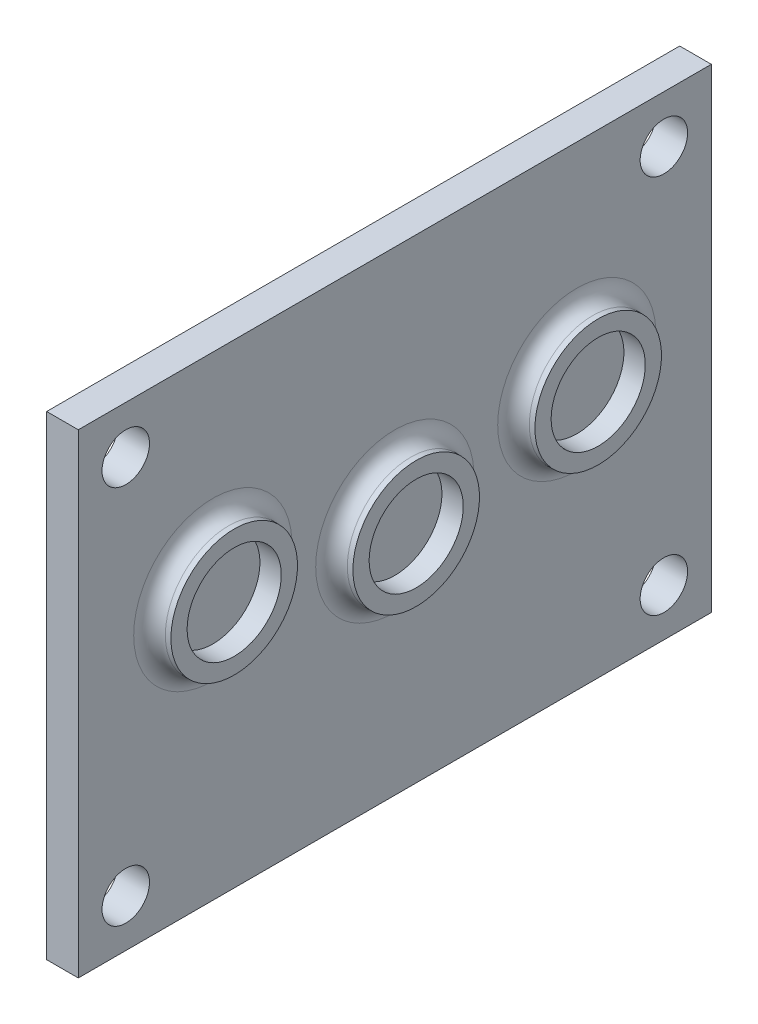
ISO-10303-21;
HEADER;
FILE_DESCRIPTION(('STEP AP214'),'2;1');
FILE_NAME('part.step','',(''),(''),'','','');
FILE_SCHEMA(('AUTOMOTIVE_DESIGN { 1 0 10303 214 1 1 1 1 }'));
ENDSEC;
DATA;
#1=APPLICATION_CONTEXT('core data for automotive mechanical design processes');
#2=APPLICATION_PROTOCOL_DEFINITION('international standard','automotive_design',2000,#1);
#3=PRODUCT_CONTEXT('',#1,'mechanical');
#4=PRODUCT('Part','Part','',(#3));
#5=PRODUCT_RELATED_PRODUCT_CATEGORY('part','',(#4));
#6=PRODUCT_DEFINITION_FORMATION('','',#4);
#7=PRODUCT_DEFINITION_CONTEXT('part definition',#1,'design');
#8=PRODUCT_DEFINITION('design','',#6,#7);
#9=PRODUCT_DEFINITION_SHAPE('','',#8);
#10=(LENGTH_UNIT() NAMED_UNIT(*) SI_UNIT(.MILLI.,.METRE.));
#11=(NAMED_UNIT(*) PLANE_ANGLE_UNIT() SI_UNIT($,.RADIAN.));
#12=(NAMED_UNIT(*) SI_UNIT($,.STERADIAN.) SOLID_ANGLE_UNIT());
#13=UNCERTAINTY_MEASURE_WITH_UNIT(LENGTH_MEASURE(1.E-05),#10,'distance_accuracy_value','');
#14=(GEOMETRIC_REPRESENTATION_CONTEXT(3) GLOBAL_UNCERTAINTY_ASSIGNED_CONTEXT((#13)) GLOBAL_UNIT_ASSIGNED_CONTEXT((#10,
#11,#12)) REPRESENTATION_CONTEXT('',''));
#15=CARTESIAN_POINT('',(0.,0.,0.));
#16=DIRECTION('',(0.,0.,1.));
#17=DIRECTION('',(1.,0.,0.));
#18=AXIS2_PLACEMENT_3D('',#15,#16,#17);
#19=CARTESIAN_POINT('',(2.,0.,0.));
#20=DIRECTION('',(0.,0.,-1.));
#21=DIRECTION('',(-1.,0.,0.));
#22=AXIS2_PLACEMENT_3D('',#19,#20,#21);
#23=PLANE('',#22);
#24=DIRECTION('',(0.,-1.,0.));
#25=VECTOR('',#24,1.);
#26=CARTESIAN_POINT('',(0.,0.,0.));
#27=LINE('',#26,#25);
#28=CARTESIAN_POINT('',(0.,30.,0.));
#29=VERTEX_POINT('',#28);
#30=CARTESIAN_POINT('',(0.,0.,0.));
#31=VERTEX_POINT('',#30);
#32=EDGE_CURVE('E107',#29,#31,#27,.T.);
#33=ORIENTED_EDGE('',*,*,#32,.T.);
#34=DIRECTION('',(-1.,0.,0.));
#35=VECTOR('',#34,1.);
#36=CARTESIAN_POINT('',(2.,0.,0.));
#37=LINE('',#36,#35);
#38=CARTESIAN_POINT('',(2.,0.,0.));
#39=VERTEX_POINT('',#38);
#40=EDGE_CURVE('E98',#39,#31,#37,.T.);
#41=ORIENTED_EDGE('',*,*,#40,.F.);
#42=DIRECTION('',(0.,-1.,0.));
#43=VECTOR('',#42,1.);
#44=CARTESIAN_POINT('',(2.,0.,0.));
#45=LINE('',#44,#43);
#46=CARTESIAN_POINT('',(2.,30.,0.));
#47=VERTEX_POINT('',#46);
#48=EDGE_CURVE('E92',#47,#39,#45,.T.);
#49=ORIENTED_EDGE('',*,*,#48,.F.);
#50=DIRECTION('',(-1.,0.,0.));
#51=VECTOR('',#50,1.);
#52=CARTESIAN_POINT('',(2.,30.,0.));
#53=LINE('',#52,#51);
#54=EDGE_CURVE('E103',#47,#29,#53,.T.);
#55=ORIENTED_EDGE('',*,*,#54,.T.);
#56=EDGE_LOOP('',(#33,#41,#49,#55));
#57=FACE_BOUND('',#56,.T.);
#58=ADVANCED_FACE('F39',(#57),#23,.F.);
#59=CARTESIAN_POINT('',(2.,0.,0.));
#60=DIRECTION('',(0.,1.,0.));
#61=DIRECTION('',(0.,0.,1.));
#62=AXIS2_PLACEMENT_3D('',#59,#60,#61);
#63=PLANE('',#62);
#64=DIRECTION('',(0.,0.,-1.));
#65=VECTOR('',#64,1.);
#66=CARTESIAN_POINT('',(0.,0.,0.));
#67=LINE('',#66,#65);
#68=CARTESIAN_POINT('',(0.,0.,-40.));
#69=VERTEX_POINT('',#68);
#70=EDGE_CURVE('E97',#31,#69,#67,.T.);
#71=ORIENTED_EDGE('',*,*,#70,.T.);
#72=DIRECTION('',(-1.,0.,0.));
#73=VECTOR('',#72,1.);
#74=CARTESIAN_POINT('',(2.,0.,-40.));
#75=LINE('',#74,#73);
#76=CARTESIAN_POINT('',(2.,0.,-40.));
#77=VERTEX_POINT('',#76);
#78=EDGE_CURVE('E95',#77,#69,#75,.T.);
#79=ORIENTED_EDGE('',*,*,#78,.F.);
#80=DIRECTION('',(0.,0.,-1.));
#81=VECTOR('',#80,1.);
#82=CARTESIAN_POINT('',(2.,0.,0.));
#83=LINE('',#82,#81);
#84=EDGE_CURVE('E87',#39,#77,#83,.T.);
#85=ORIENTED_EDGE('',*,*,#84,.F.);
#86=ORIENTED_EDGE('',*,*,#40,.T.);
#87=EDGE_LOOP('',(#71,#79,#85,#86));
#88=FACE_BOUND('',#87,.T.);
#89=ADVANCED_FACE('F96',(#88),#63,.F.);
#90=CARTESIAN_POINT('',(2.,0.,-40.));
#91=DIRECTION('',(0.,0.,1.));
#92=DIRECTION('',(1.,0.,0.));
#93=AXIS2_PLACEMENT_3D('',#90,#91,#92);
#94=PLANE('',#93);
#95=DIRECTION('',(0.,1.,0.));
#96=VECTOR('',#95,1.);
#97=CARTESIAN_POINT('',(0.,0.,-40.));
#98=LINE('',#97,#96);
#99=CARTESIAN_POINT('',(0.,30.,-40.));
#100=VERTEX_POINT('',#99);
#101=EDGE_CURVE('E73',#69,#100,#98,.T.);
#102=ORIENTED_EDGE('',*,*,#101,.T.);
#103=DIRECTION('',(-1.,0.,0.));
#104=VECTOR('',#103,1.);
#105=CARTESIAN_POINT('',(2.,30.,-40.));
#106=LINE('',#105,#104);
#107=CARTESIAN_POINT('',(2.,30.,-40.));
#108=VERTEX_POINT('',#107);
#109=EDGE_CURVE('E99',#108,#100,#106,.T.);
#110=ORIENTED_EDGE('',*,*,#109,.F.);
#111=DIRECTION('',(0.,1.,0.));
#112=VECTOR('',#111,1.);
#113=CARTESIAN_POINT('',(2.,0.,-40.));
#114=LINE('',#113,#112);
#115=EDGE_CURVE('E90',#77,#108,#114,.T.);
#116=ORIENTED_EDGE('',*,*,#115,.F.);
#117=ORIENTED_EDGE('',*,*,#78,.T.);
#118=EDGE_LOOP('',(#102,#110,#116,#117));
#119=FACE_BOUND('',#118,.T.);
#120=ADVANCED_FACE('F101',(#119),#94,.F.);
#121=CARTESIAN_POINT('',(2.,30.,0.));
#122=DIRECTION('',(0.,-1.,0.));
#123=DIRECTION('',(0.,0.,-1.));
#124=AXIS2_PLACEMENT_3D('',#121,#122,#123);
#125=PLANE('',#124);
#126=DIRECTION('',(0.,0.,1.));
#127=VECTOR('',#126,1.);
#128=CARTESIAN_POINT('',(0.,30.,0.));
#129=LINE('',#128,#127);
#130=EDGE_CURVE('E79',#100,#29,#129,.T.);
#131=ORIENTED_EDGE('',*,*,#130,.T.);
#132=ORIENTED_EDGE('',*,*,#54,.F.);
#133=DIRECTION('',(0.,0.,1.));
#134=VECTOR('',#133,1.);
#135=CARTESIAN_POINT('',(2.,30.,0.));
#136=LINE('',#135,#134);
#137=EDGE_CURVE('E56',#108,#47,#136,.T.);
#138=ORIENTED_EDGE('',*,*,#137,.F.);
#139=ORIENTED_EDGE('',*,*,#109,.T.);
#140=EDGE_LOOP('',(#131,#132,#138,#139));
#141=FACE_BOUND('',#140,.T.);
#142=ADVANCED_FACE('F158',(#141),#125,.F.);
#143=CARTESIAN_POINT('',(2.,0.,0.));
#144=DIRECTION('',(-1.,0.,0.));
#145=DIRECTION('',(0.,0.,1.));
#146=AXIS2_PLACEMENT_3D('',#143,#144,#145);
#147=PLANE('',#146);
#148=CARTESIAN_POINT('',(2.,27.,-3.));
#149=DIRECTION('',(-1.,0.,0.));
#150=DIRECTION('',(0.,0.,1.));
#151=AXIS2_PLACEMENT_3D('',#148,#149,#150);
#152=CIRCLE('',#151,1.5);
#153=CARTESIAN_POINT('',(2.,27.,-1.5));
#154=VERTEX_POINT('',#153);
#155=EDGE_CURVE('E239',#154,#154,#152,.T.);
#156=ORIENTED_EDGE('',*,*,#155,.T.);
#157=EDGE_LOOP('',(#156));
#158=FACE_BOUND('',#157,.T.);
#159=CARTESIAN_POINT('',(2.,3.,-37.));
#160=DIRECTION('',(-1.,0.,0.));
#161=DIRECTION('',(0.,0.,1.));
#162=AXIS2_PLACEMENT_3D('',#159,#160,#161);
#163=CIRCLE('',#162,1.5);
#164=CARTESIAN_POINT('',(2.,3.,-35.5));
#165=VERTEX_POINT('',#164);
#166=EDGE_CURVE('E228',#165,#165,#163,.T.);
#167=ORIENTED_EDGE('',*,*,#166,.T.);
#168=EDGE_LOOP('',(#167));
#169=FACE_BOUND('',#168,.T.);
#170=CARTESIAN_POINT('',(2.,3.,-3.));
#171=DIRECTION('',(-1.,0.,0.));
#172=DIRECTION('',(0.,0.,1.));
#173=AXIS2_PLACEMENT_3D('',#170,#171,#172);
#174=CIRCLE('',#173,1.5);
#175=CARTESIAN_POINT('',(2.,3.,-1.5));
#176=VERTEX_POINT('',#175);
#177=EDGE_CURVE('E223',#176,#176,#174,.T.);
#178=ORIENTED_EDGE('',*,*,#177,.T.);
#179=EDGE_LOOP('',(#178));
#180=FACE_BOUND('',#179,.T.);
#181=CARTESIAN_POINT('',(2.,27.,-37.));
#182=DIRECTION('',(-1.,0.,0.));
#183=DIRECTION('',(0.,0.,1.));
#184=AXIS2_PLACEMENT_3D('',#181,#182,#183);
#185=CIRCLE('',#184,1.5);
#186=CARTESIAN_POINT('',(2.,27.,-35.5));
#187=VERTEX_POINT('',#186);
#188=EDGE_CURVE('E244',#187,#187,#185,.T.);
#189=ORIENTED_EDGE('',*,*,#188,.T.);
#190=EDGE_LOOP('',(#189));
#191=FACE_BOUND('',#190,.T.);
#192=CARTESIAN_POINT('',(2.,17.,-8.5));
#193=DIRECTION('',(-1.,0.,0.));
#194=DIRECTION('',(0.,0.,1.));
#195=AXIS2_PLACEMENT_3D('',#192,#193,#194);
#196=CIRCLE('',#195,5.);
#197=CARTESIAN_POINT('',(2.,17.,-3.5));
#198=VERTEX_POINT('',#197);
#199=EDGE_CURVE('E126',#198,#198,#196,.T.);
#200=ORIENTED_EDGE('',*,*,#199,.T.);
#201=EDGE_LOOP('',(#200));
#202=FACE_BOUND('',#201,.T.);
#203=CARTESIAN_POINT('',(2.,17.,-31.5));
#204=DIRECTION('',(-1.,0.,0.));
#205=DIRECTION('',(0.,0.,1.));
#206=AXIS2_PLACEMENT_3D('',#203,#204,#205);
#207=CIRCLE('',#206,5.00000000000001);
#208=CARTESIAN_POINT('',(2.,17.,-26.5));
#209=VERTEX_POINT('',#208);
#210=EDGE_CURVE('E123',#209,#209,#207,.T.);
#211=ORIENTED_EDGE('',*,*,#210,.T.);
#212=EDGE_LOOP('',(#211));
#213=FACE_BOUND('',#212,.T.);
#214=CARTESIAN_POINT('',(2.,15.,-20.));
#215=DIRECTION('',(-1.,0.,0.));
#216=DIRECTION('',(0.,0.,1.));
#217=AXIS2_PLACEMENT_3D('',#214,#215,#216);
#218=CIRCLE('',#217,5.);
#219=CARTESIAN_POINT('',(2.,15.,-15.));
#220=VERTEX_POINT('',#219);
#221=EDGE_CURVE('E120',#220,#220,#218,.T.);
#222=ORIENTED_EDGE('',*,*,#221,.T.);
#223=EDGE_LOOP('',(#222));
#224=FACE_BOUND('',#223,.T.);
#225=ORIENTED_EDGE('',*,*,#48,.T.);
#226=ORIENTED_EDGE('',*,*,#84,.T.);
#227=ORIENTED_EDGE('',*,*,#115,.T.);
#228=ORIENTED_EDGE('',*,*,#137,.T.);
#229=EDGE_LOOP('',(#225,#226,#227,#228));
#230=FACE_BOUND('',#229,.T.);
#231=ADVANCED_FACE('F88',(#158,#169,#180,#191,#202,#213,#224,#230),#147,.F.);
#232=CARTESIAN_POINT('',(0.,0.,0.));
#233=DIRECTION('',(-1.,0.,0.));
#234=DIRECTION('',(0.,0.,1.));
#235=AXIS2_PLACEMENT_3D('',#232,#233,#234);
#236=PLANE('',#235);
#237=CARTESIAN_POINT('',(0.,27.,-3.));
#238=DIRECTION('',(-1.,0.,0.));
#239=DIRECTION('',(0.,0.,1.));
#240=AXIS2_PLACEMENT_3D('',#237,#238,#239);
#241=CIRCLE('',#240,1.5);
#242=CARTESIAN_POINT('',(0.,27.,-1.5));
#243=VERTEX_POINT('',#242);
#244=EDGE_CURVE('E235',#243,#243,#241,.T.);
#245=ORIENTED_EDGE('',*,*,#244,.F.);
#246=EDGE_LOOP('',(#245));
#247=FACE_BOUND('',#246,.T.);
#248=CARTESIAN_POINT('',(0.,3.,-37.));
#249=DIRECTION('',(-1.,0.,0.));
#250=DIRECTION('',(0.,0.,1.));
#251=AXIS2_PLACEMENT_3D('',#248,#249,#250);
#252=CIRCLE('',#251,1.5);
#253=CARTESIAN_POINT('',(0.,3.,-35.5));
#254=VERTEX_POINT('',#253);
#255=EDGE_CURVE('E231',#254,#254,#252,.T.);
#256=ORIENTED_EDGE('',*,*,#255,.F.);
#257=EDGE_LOOP('',(#256));
#258=FACE_BOUND('',#257,.T.);
#259=CARTESIAN_POINT('',(0.,3.,-3.));
#260=DIRECTION('',(-1.,0.,0.));
#261=DIRECTION('',(0.,0.,1.));
#262=AXIS2_PLACEMENT_3D('',#259,#260,#261);
#263=CIRCLE('',#262,1.5);
#264=CARTESIAN_POINT('',(0.,3.,-1.5));
#265=VERTEX_POINT('',#264);
#266=EDGE_CURVE('E226',#265,#265,#263,.T.);
#267=ORIENTED_EDGE('',*,*,#266,.F.);
#268=EDGE_LOOP('',(#267));
#269=FACE_BOUND('',#268,.T.);
#270=CARTESIAN_POINT('',(0.,27.,-37.));
#271=DIRECTION('',(-1.,0.,0.));
#272=DIRECTION('',(0.,0.,1.));
#273=AXIS2_PLACEMENT_3D('',#270,#271,#272);
#274=CIRCLE('',#273,1.5);
#275=CARTESIAN_POINT('',(0.,27.,-35.5));
#276=VERTEX_POINT('',#275);
#277=EDGE_CURVE('E238',#276,#276,#274,.T.);
#278=ORIENTED_EDGE('',*,*,#277,.F.);
#279=EDGE_LOOP('',(#278));
#280=FACE_BOUND('',#279,.T.);
#281=ORIENTED_EDGE('',*,*,#32,.F.);
#282=ORIENTED_EDGE('',*,*,#130,.F.);
#283=ORIENTED_EDGE('',*,*,#101,.F.);
#284=ORIENTED_EDGE('',*,*,#70,.F.);
#285=EDGE_LOOP('',(#281,#282,#283,#284));
#286=FACE_BOUND('',#285,.T.);
#287=ADVANCED_FACE('F161',(#247,#258,#269,#280,#286),#236,.T.);
#288=CARTESIAN_POINT('',(3.35,17.,-8.5));
#289=DIRECTION('',(1.,0.,0.));
#290=DIRECTION('',(0.,0.,-1.));
#291=AXIS2_PLACEMENT_3D('',#288,#289,#290);
#292=PLANE('',#291);
#293=CARTESIAN_POINT('',(3.35,17.,-8.5));
#294=DIRECTION('',(1.,0.,0.));
#295=DIRECTION('',(0.,0.,-1.));
#296=AXIS2_PLACEMENT_3D('',#293,#294,#295);
#297=CIRCLE('',#296,4.);
#298=CARTESIAN_POINT('',(3.35,17.,-4.5));
#299=VERTEX_POINT('',#298);
#300=EDGE_CURVE('E110',#299,#299,#297,.T.);
#301=ORIENTED_EDGE('',*,*,#300,.T.);
#302=EDGE_LOOP('',(#301));
#303=FACE_BOUND('',#302,.T.);
#304=CARTESIAN_POINT('',(3.35,17.,-8.5));
#305=DIRECTION('',(1.,0.,0.));
#306=DIRECTION('',(0.,0.,-1.));
#307=AXIS2_PLACEMENT_3D('',#304,#305,#306);
#308=CIRCLE('',#307,2.975);
#309=CARTESIAN_POINT('',(3.35,17.,-5.525));
#310=VERTEX_POINT('',#309);
#311=EDGE_CURVE('E268',#310,#310,#308,.T.);
#312=ORIENTED_EDGE('',*,*,#311,.F.);
#313=EDGE_LOOP('',(#312));
#314=FACE_BOUND('',#313,.T.);
#315=ADVANCED_FACE('F164',(#303,#314),#292,.T.);
#316=CARTESIAN_POINT('',(3.35,17.,-8.5));
#317=DIRECTION('',(-1.,0.,0.));
#318=DIRECTION('',(0.,0.,1.));
#319=AXIS2_PLACEMENT_3D('',#316,#317,#318);
#320=CYLINDRICAL_SURFACE('',#319,4.);
#321=CARTESIAN_POINT('',(3.,17.,-8.5));
#322=DIRECTION('',(-1.,0.,0.));
#323=DIRECTION('',(0.,0.,1.));
#324=AXIS2_PLACEMENT_3D('',#321,#322,#323);
#325=CIRCLE('',#324,4.);
#326=CARTESIAN_POINT('',(3.,17.,-4.5));
#327=VERTEX_POINT('',#326);
#328=EDGE_CURVE('E117',#327,#327,#325,.F.);
#329=CARTESIAN_POINT('',(3.,17.,-4.5));
#330=CARTESIAN_POINT('',(3.00364583333333,17.,-4.5));
#331=CARTESIAN_POINT('',(3.00729166666667,17.,-4.5));
#332=CARTESIAN_POINT('',(3.01458333333333,17.,-4.5));
#333=CARTESIAN_POINT('',(3.01822916666667,17.,-4.5));
#334=CARTESIAN_POINT('',(3.02552083333333,17.,-4.5));
#335=CARTESIAN_POINT('',(3.02916666666667,17.,-4.5));
#336=CARTESIAN_POINT('',(3.03645833333333,17.,-4.5));
#337=CARTESIAN_POINT('',(3.04010416666667,17.,-4.5));
#338=CARTESIAN_POINT('',(3.04739583333333,17.,-4.5));
#339=CARTESIAN_POINT('',(3.05104166666667,17.,-4.5));
#340=CARTESIAN_POINT('',(3.05833333333333,17.,-4.5));
#341=CARTESIAN_POINT('',(3.06197916666667,17.,-4.5));
#342=CARTESIAN_POINT('',(3.06927083333333,17.,-4.5));
#343=CARTESIAN_POINT('',(3.07291666666667,17.,-4.5));
#344=CARTESIAN_POINT('',(3.08020833333333,17.,-4.5));
#345=CARTESIAN_POINT('',(3.08385416666667,17.,-4.5));
#346=CARTESIAN_POINT('',(3.09114583333333,17.,-4.5));
#347=CARTESIAN_POINT('',(3.09479166666667,17.,-4.5));
#348=CARTESIAN_POINT('',(3.10208333333333,17.,-4.5));
#349=CARTESIAN_POINT('',(3.10572916666667,17.,-4.5));
#350=CARTESIAN_POINT('',(3.11302083333333,17.,-4.5));
#351=CARTESIAN_POINT('',(3.11666666666667,17.,-4.5));
#352=CARTESIAN_POINT('',(3.12395833333333,17.,-4.5));
#353=CARTESIAN_POINT('',(3.12760416666667,17.,-4.5));
#354=CARTESIAN_POINT('',(3.13489583333333,17.,-4.5));
#355=CARTESIAN_POINT('',(3.13854166666667,17.,-4.5));
#356=CARTESIAN_POINT('',(3.14583333333333,17.,-4.5));
#357=CARTESIAN_POINT('',(3.14947916666667,17.,-4.5));
#358=CARTESIAN_POINT('',(3.15677083333333,17.,-4.5));
#359=CARTESIAN_POINT('',(3.16041666666667,17.,-4.5));
#360=CARTESIAN_POINT('',(3.16770833333333,17.,-4.5));
#361=CARTESIAN_POINT('',(3.17135416666667,17.,-4.5));
#362=CARTESIAN_POINT('',(3.17864583333333,17.,-4.5));
#363=CARTESIAN_POINT('',(3.18229166666667,17.,-4.5));
#364=CARTESIAN_POINT('',(3.18958333333333,17.,-4.5));
#365=CARTESIAN_POINT('',(3.19322916666667,17.,-4.5));
#366=CARTESIAN_POINT('',(3.20052083333333,17.,-4.5));
#367=CARTESIAN_POINT('',(3.20416666666667,17.,-4.5));
#368=CARTESIAN_POINT('',(3.21145833333333,17.,-4.5));
#369=CARTESIAN_POINT('',(3.21510416666667,17.,-4.5));
#370=CARTESIAN_POINT('',(3.22239583333333,17.,-4.5));
#371=CARTESIAN_POINT('',(3.22604166666667,17.,-4.5));
#372=CARTESIAN_POINT('',(3.23333333333333,17.,-4.5));
#373=CARTESIAN_POINT('',(3.23697916666667,17.,-4.5));
#374=CARTESIAN_POINT('',(3.24427083333333,17.,-4.5));
#375=CARTESIAN_POINT('',(3.24791666666667,17.,-4.5));
#376=CARTESIAN_POINT('',(3.25520833333333,17.,-4.5));
#377=CARTESIAN_POINT('',(3.25885416666667,17.,-4.5));
#378=CARTESIAN_POINT('',(3.26614583333333,17.,-4.5));
#379=CARTESIAN_POINT('',(3.26979166666667,17.,-4.5));
#380=CARTESIAN_POINT('',(3.27708333333333,17.,-4.5));
#381=CARTESIAN_POINT('',(3.28072916666667,17.,-4.5));
#382=CARTESIAN_POINT('',(3.28802083333333,17.,-4.5));
#383=CARTESIAN_POINT('',(3.29166666666667,17.,-4.5));
#384=CARTESIAN_POINT('',(3.29895833333333,17.,-4.5));
#385=CARTESIAN_POINT('',(3.30260416666667,17.,-4.5));
#386=CARTESIAN_POINT('',(3.30989583333333,17.,-4.5));
#387=CARTESIAN_POINT('',(3.31354166666667,17.,-4.5));
#388=CARTESIAN_POINT('',(3.32083333333333,17.,-4.5));
#389=CARTESIAN_POINT('',(3.32447916666667,17.,-4.5));
#390=CARTESIAN_POINT('',(3.33177083333333,17.,-4.5));
#391=CARTESIAN_POINT('',(3.33541666666667,17.,-4.5));
#392=CARTESIAN_POINT('',(3.34270833333333,17.,-4.5));
#393=CARTESIAN_POINT('',(3.34635416666667,17.,-4.5));
#394=CARTESIAN_POINT('',(3.35,17.,-4.5));
#395=B_SPLINE_CURVE_WITH_KNOTS('',3,(#329,#330,#331,#332,#333,#334,#335,#336,#337,#338,#339,
#340,#341,#342,#343,#344,#345,#346,#347,#348,#349,#350,#351,#352,#353,#354,#355,#356,#357,#358,
#359,#360,#361,#362,#363,#364,#365,#366,#367,#368,#369,#370,#371,#372,#373,#374,#375,#376,#377,
#378,#379,#380,#381,#382,#383,#384,#385,#386,#387,#388,#389,#390,#391,#392,#393,#394),
.UNSPECIFIED.,.F.,.F.,(4,2,2,2,2,2,2,2,2,2,2,2,2,2,2,2,2,2,2,2,2,2,2,2,2,2,2,2,2,2,2,2,4),(0.,
0.0109374999999997,0.0218749999999998,0.0328124999999999,0.04375,0.0546874999999996,
0.0656249999999997,0.0765624999999998,0.0874999999999999,0.0984374999999996,0.109375,0.1203125,
0.13125,0.1421875,0.153125,0.1640625,0.175,0.185937499999999,0.196875,0.2078125,0.21875,
0.229687499999999,0.240625,0.2515625,0.2625,0.273437499999999,0.284374999999999,0.2953125,
0.30625,0.317187499999999,0.328124999999999,0.3390625,0.35),.UNSPECIFIED.);
#396=EDGE_CURVE('BSEAM170',#327,#299,#395,.T.);
#397=ORIENTED_EDGE('',*,*,#328,.T.);
#398=ORIENTED_EDGE('',*,*,#300,.F.);
#399=ORIENTED_EDGE('',*,*,#396,.T.);
#400=ORIENTED_EDGE('',*,*,#396,.F.);
#401=EDGE_LOOP('',(#397,#399,#398,#400));
#402=FACE_BOUND('',#401,.T.);
#403=ADVANCED_FACE('F170',(#402),#320,.T.);
#404=CARTESIAN_POINT('',(3.35,17.,-8.5));
#405=DIRECTION('',(-1.,0.,0.));
#406=DIRECTION('',(0.,0.,1.));
#407=AXIS2_PLACEMENT_3D('',#404,#405,#406);
#408=CYLINDRICAL_SURFACE('',#407,2.975);
#409=CARTESIAN_POINT('',(2.,17.,-8.5));
#410=DIRECTION('',(1.,0.,0.));
#411=DIRECTION('',(0.,0.,-1.));
#412=AXIS2_PLACEMENT_3D('',#409,#410,#411);
#413=CIRCLE('',#412,2.975);
#414=CARTESIAN_POINT('',(2.,17.,-5.525));
#415=VERTEX_POINT('',#414);
#416=EDGE_CURVE('E265',#415,#415,#413,.T.);
#417=CARTESIAN_POINT('',(3.35,17.,-5.525));
#418=CARTESIAN_POINT('',(3.3359375,17.,-5.525));
#419=CARTESIAN_POINT('',(3.321875,17.,-5.525));
#420=CARTESIAN_POINT('',(3.29375,17.,-5.525));
#421=CARTESIAN_POINT('',(3.2796875,17.,-5.525));
#422=CARTESIAN_POINT('',(3.2515625,17.,-5.525));
#423=CARTESIAN_POINT('',(3.2375,17.,-5.525));
#424=CARTESIAN_POINT('',(3.209375,17.,-5.525));
#425=CARTESIAN_POINT('',(3.1953125,17.,-5.525));
#426=CARTESIAN_POINT('',(3.1671875,17.,-5.525));
#427=CARTESIAN_POINT('',(3.153125,17.,-5.525));
#428=CARTESIAN_POINT('',(3.125,17.,-5.525));
#429=CARTESIAN_POINT('',(3.1109375,17.,-5.525));
#430=CARTESIAN_POINT('',(3.0828125,17.,-5.525));
#431=CARTESIAN_POINT('',(3.06875,17.,-5.525));
#432=CARTESIAN_POINT('',(3.040625,17.,-5.525));
#433=CARTESIAN_POINT('',(3.0265625,17.,-5.525));
#434=CARTESIAN_POINT('',(2.9984375,17.,-5.525));
#435=CARTESIAN_POINT('',(2.984375,17.,-5.525));
#436=CARTESIAN_POINT('',(2.95625,17.,-5.525));
#437=CARTESIAN_POINT('',(2.9421875,17.,-5.525));
#438=CARTESIAN_POINT('',(2.9140625,17.,-5.525));
#439=CARTESIAN_POINT('',(2.9,17.,-5.525));
#440=CARTESIAN_POINT('',(2.871875,17.,-5.525));
#441=CARTESIAN_POINT('',(2.8578125,17.,-5.525));
#442=CARTESIAN_POINT('',(2.8296875,17.,-5.525));
#443=CARTESIAN_POINT('',(2.815625,17.,-5.525));
#444=CARTESIAN_POINT('',(2.7875,17.,-5.525));
#445=CARTESIAN_POINT('',(2.7734375,17.,-5.525));
#446=CARTESIAN_POINT('',(2.7453125,17.,-5.525));
#447=CARTESIAN_POINT('',(2.73125,17.,-5.525));
#448=CARTESIAN_POINT('',(2.703125,17.,-5.525));
#449=CARTESIAN_POINT('',(2.6890625,17.,-5.525));
#450=CARTESIAN_POINT('',(2.6609375,17.,-5.525));
#451=CARTESIAN_POINT('',(2.646875,17.,-5.525));
#452=CARTESIAN_POINT('',(2.61875,17.,-5.525));
#453=CARTESIAN_POINT('',(2.6046875,17.,-5.525));
#454=CARTESIAN_POINT('',(2.5765625,17.,-5.525));
#455=CARTESIAN_POINT('',(2.5625,17.,-5.525));
#456=CARTESIAN_POINT('',(2.534375,17.,-5.525));
#457=CARTESIAN_POINT('',(2.5203125,17.,-5.525));
#458=CARTESIAN_POINT('',(2.4921875,17.,-5.525));
#459=CARTESIAN_POINT('',(2.478125,17.,-5.525));
#460=CARTESIAN_POINT('',(2.45,17.,-5.525));
#461=CARTESIAN_POINT('',(2.4359375,17.,-5.525));
#462=CARTESIAN_POINT('',(2.4078125,17.,-5.525));
#463=CARTESIAN_POINT('',(2.39375,17.,-5.525));
#464=CARTESIAN_POINT('',(2.365625,17.,-5.525));
#465=CARTESIAN_POINT('',(2.3515625,17.,-5.525));
#466=CARTESIAN_POINT('',(2.3234375,17.,-5.525));
#467=CARTESIAN_POINT('',(2.309375,17.,-5.525));
#468=CARTESIAN_POINT('',(2.28125,17.,-5.525));
#469=CARTESIAN_POINT('',(2.2671875,17.,-5.525));
#470=CARTESIAN_POINT('',(2.2390625,17.,-5.525));
#471=CARTESIAN_POINT('',(2.225,17.,-5.525));
#472=CARTESIAN_POINT('',(2.196875,17.,-5.525));
#473=CARTESIAN_POINT('',(2.1828125,17.,-5.525));
#474=CARTESIAN_POINT('',(2.1546875,17.,-5.525));
#475=CARTESIAN_POINT('',(2.140625,17.,-5.525));
#476=CARTESIAN_POINT('',(2.1125,17.,-5.525));
#477=CARTESIAN_POINT('',(2.0984375,17.,-5.525));
#478=CARTESIAN_POINT('',(2.0703125,17.,-5.525));
#479=CARTESIAN_POINT('',(2.05625,17.,-5.525));
#480=CARTESIAN_POINT('',(2.028125,17.,-5.525));
#481=CARTESIAN_POINT('',(2.0140625,17.,-5.525));
#482=CARTESIAN_POINT('',(2.,17.,-5.525));
#483=B_SPLINE_CURVE_WITH_KNOTS('',3,(#417,#418,#419,#420,#421,#422,#423,#424,#425,#426,#427,
#428,#429,#430,#431,#432,#433,#434,#435,#436,#437,#438,#439,#440,#441,#442,#443,#444,#445,#446,
#447,#448,#449,#450,#451,#452,#453,#454,#455,#456,#457,#458,#459,#460,#461,#462,#463,#464,#465,
#466,#467,#468,#469,#470,#471,#472,#473,#474,#475,#476,#477,#478,#479,#480,#481,#482),
.UNSPECIFIED.,.F.,.F.,(4,2,2,2,2,2,2,2,2,2,2,2,2,2,2,2,2,2,2,2,2,2,2,2,2,2,2,2,2,2,2,2,4),(0.,
0.0421875000000001,0.0843750000000003,0.1265625,0.16875,0.2109375,0.253125,0.2953125,0.3375,
0.3796875,0.421875,0.4640625,0.50625,0.5484375,0.590625,0.6328125,0.675,0.7171875,0.759375,
0.8015625,0.84375,0.8859375,0.928125000000001,0.9703125,1.0125,1.0546875,1.096875,1.1390625,
1.18125,1.2234375,1.265625,1.3078125,1.35),.UNSPECIFIED.);
#484=EDGE_CURVE('BSEAM173',#310,#415,#483,.T.);
#485=ORIENTED_EDGE('',*,*,#311,.T.);
#486=ORIENTED_EDGE('',*,*,#416,.F.);
#487=ORIENTED_EDGE('',*,*,#484,.T.);
#488=ORIENTED_EDGE('',*,*,#484,.F.);
#489=EDGE_LOOP('',(#485,#487,#486,#488));
#490=FACE_BOUND('',#489,.T.);
#491=ADVANCED_FACE('F173',(#490),#408,.F.);
#492=ORIENTED_EDGE('',*,*,#416,.T.);
#493=EDGE_LOOP('',(#492));
#494=FACE_BOUND('',#493,.T.);
#495=ADVANCED_FACE('F169',(#494),#147,.F.);
#496=CARTESIAN_POINT('',(3.35,15.,-20.));
#497=DIRECTION('',(1.,0.,0.));
#498=DIRECTION('',(0.,0.,-1.));
#499=AXIS2_PLACEMENT_3D('',#496,#497,#498);
#500=PLANE('',#499);
#501=CARTESIAN_POINT('',(3.35,15.,-20.));
#502=DIRECTION('',(1.,0.,0.));
#503=DIRECTION('',(0.,0.,-1.));
#504=AXIS2_PLACEMENT_3D('',#501,#502,#503);
#505=CIRCLE('',#504,4.);
#506=CARTESIAN_POINT('',(3.35,15.,-16.));
#507=VERTEX_POINT('',#506);
#508=EDGE_CURVE('E256',#507,#507,#505,.T.);
#509=ORIENTED_EDGE('',*,*,#508,.T.);
#510=EDGE_LOOP('',(#509));
#511=FACE_BOUND('',#510,.T.);
#512=CARTESIAN_POINT('',(3.35,15.,-20.));
#513=DIRECTION('',(1.,0.,0.));
#514=DIRECTION('',(0.,0.,-1.));
#515=AXIS2_PLACEMENT_3D('',#512,#513,#514);
#516=CIRCLE('',#515,2.975);
#517=CARTESIAN_POINT('',(3.35,15.,-17.025));
#518=VERTEX_POINT('',#517);
#519=EDGE_CURVE('E261',#518,#518,#516,.T.);
#520=ORIENTED_EDGE('',*,*,#519,.F.);
#521=EDGE_LOOP('',(#520));
#522=FACE_BOUND('',#521,.T.);
#523=ADVANCED_FACE('F187',(#511,#522),#500,.T.);
#524=CARTESIAN_POINT('',(3.35,15.,-20.));
#525=DIRECTION('',(-1.,0.,0.));
#526=DIRECTION('',(0.,0.,1.));
#527=AXIS2_PLACEMENT_3D('',#524,#525,#526);
#528=CYLINDRICAL_SURFACE('',#527,4.);
#529=CARTESIAN_POINT('',(3.,15.,-20.));
#530=DIRECTION('',(-1.,0.,0.));
#531=DIRECTION('',(0.,0.,1.));
#532=AXIS2_PLACEMENT_3D('',#529,#530,#531);
#533=CIRCLE('',#532,4.);
#534=CARTESIAN_POINT('',(3.,15.,-16.));
#535=VERTEX_POINT('',#534);
#536=EDGE_CURVE('E11',#535,#535,#533,.F.);
#537=CARTESIAN_POINT('',(3.,15.,-16.));
#538=CARTESIAN_POINT('',(3.00364583333333,15.,-16.));
#539=CARTESIAN_POINT('',(3.00729166666667,15.,-16.));
#540=CARTESIAN_POINT('',(3.01458333333333,15.,-16.));
#541=CARTESIAN_POINT('',(3.01822916666667,15.,-16.));
#542=CARTESIAN_POINT('',(3.02552083333333,15.,-16.));
#543=CARTESIAN_POINT('',(3.02916666666667,15.,-16.));
#544=CARTESIAN_POINT('',(3.03645833333333,15.,-16.));
#545=CARTESIAN_POINT('',(3.04010416666667,15.,-16.));
#546=CARTESIAN_POINT('',(3.04739583333333,15.,-16.));
#547=CARTESIAN_POINT('',(3.05104166666667,15.,-16.));
#548=CARTESIAN_POINT('',(3.05833333333333,15.,-16.));
#549=CARTESIAN_POINT('',(3.06197916666667,15.,-16.));
#550=CARTESIAN_POINT('',(3.06927083333333,15.,-16.));
#551=CARTESIAN_POINT('',(3.07291666666667,15.,-16.));
#552=CARTESIAN_POINT('',(3.08020833333333,15.,-16.));
#553=CARTESIAN_POINT('',(3.08385416666667,15.,-16.));
#554=CARTESIAN_POINT('',(3.09114583333333,15.,-16.));
#555=CARTESIAN_POINT('',(3.09479166666667,15.,-16.));
#556=CARTESIAN_POINT('',(3.10208333333333,15.,-16.));
#557=CARTESIAN_POINT('',(3.10572916666667,15.,-16.));
#558=CARTESIAN_POINT('',(3.11302083333333,15.,-16.));
#559=CARTESIAN_POINT('',(3.11666666666667,15.,-16.));
#560=CARTESIAN_POINT('',(3.12395833333333,15.,-16.));
#561=CARTESIAN_POINT('',(3.12760416666667,15.,-16.));
#562=CARTESIAN_POINT('',(3.13489583333333,15.,-16.));
#563=CARTESIAN_POINT('',(3.13854166666667,15.,-16.));
#564=CARTESIAN_POINT('',(3.14583333333333,15.,-16.));
#565=CARTESIAN_POINT('',(3.14947916666667,15.,-16.));
#566=CARTESIAN_POINT('',(3.15677083333333,15.,-16.));
#567=CARTESIAN_POINT('',(3.16041666666667,15.,-16.));
#568=CARTESIAN_POINT('',(3.16770833333333,15.,-16.));
#569=CARTESIAN_POINT('',(3.17135416666667,15.,-16.));
#570=CARTESIAN_POINT('',(3.17864583333333,15.,-16.));
#571=CARTESIAN_POINT('',(3.18229166666667,15.,-16.));
#572=CARTESIAN_POINT('',(3.18958333333333,15.,-16.));
#573=CARTESIAN_POINT('',(3.19322916666667,15.,-16.));
#574=CARTESIAN_POINT('',(3.20052083333333,15.,-16.));
#575=CARTESIAN_POINT('',(3.20416666666667,15.,-16.));
#576=CARTESIAN_POINT('',(3.21145833333333,15.,-16.));
#577=CARTESIAN_POINT('',(3.21510416666667,15.,-16.));
#578=CARTESIAN_POINT('',(3.22239583333333,15.,-16.));
#579=CARTESIAN_POINT('',(3.22604166666667,15.,-16.));
#580=CARTESIAN_POINT('',(3.23333333333333,15.,-16.));
#581=CARTESIAN_POINT('',(3.23697916666667,15.,-16.));
#582=CARTESIAN_POINT('',(3.24427083333333,15.,-16.));
#583=CARTESIAN_POINT('',(3.24791666666667,15.,-16.));
#584=CARTESIAN_POINT('',(3.25520833333333,15.,-16.));
#585=CARTESIAN_POINT('',(3.25885416666667,15.,-16.));
#586=CARTESIAN_POINT('',(3.26614583333333,15.,-16.));
#587=CARTESIAN_POINT('',(3.26979166666667,15.,-16.));
#588=CARTESIAN_POINT('',(3.27708333333333,15.,-16.));
#589=CARTESIAN_POINT('',(3.28072916666667,15.,-16.));
#590=CARTESIAN_POINT('',(3.28802083333333,15.,-16.));
#591=CARTESIAN_POINT('',(3.29166666666667,15.,-16.));
#592=CARTESIAN_POINT('',(3.29895833333333,15.,-16.));
#593=CARTESIAN_POINT('',(3.30260416666667,15.,-16.));
#594=CARTESIAN_POINT('',(3.30989583333333,15.,-16.));
#595=CARTESIAN_POINT('',(3.31354166666667,15.,-16.));
#596=CARTESIAN_POINT('',(3.32083333333333,15.,-16.));
#597=CARTESIAN_POINT('',(3.32447916666667,15.,-16.));
#598=CARTESIAN_POINT('',(3.33177083333333,15.,-16.));
#599=CARTESIAN_POINT('',(3.33541666666667,15.,-16.));
#600=CARTESIAN_POINT('',(3.34270833333333,15.,-16.));
#601=CARTESIAN_POINT('',(3.34635416666667,15.,-16.));
#602=CARTESIAN_POINT('',(3.35,15.,-16.));
#603=B_SPLINE_CURVE_WITH_KNOTS('',3,(#537,#538,#539,#540,#541,#542,#543,#544,#545,#546,#547,
#548,#549,#550,#551,#552,#553,#554,#555,#556,#557,#558,#559,#560,#561,#562,#563,#564,#565,#566,
#567,#568,#569,#570,#571,#572,#573,#574,#575,#576,#577,#578,#579,#580,#581,#582,#583,#584,#585,
#586,#587,#588,#589,#590,#591,#592,#593,#594,#595,#596,#597,#598,#599,#600,#601,#602),
.UNSPECIFIED.,.F.,.F.,(4,2,2,2,2,2,2,2,2,2,2,2,2,2,2,2,2,2,2,2,2,2,2,2,2,2,2,2,2,2,2,2,4),(0.,
0.0109374999999997,0.0218749999999998,0.0328124999999999,0.04375,0.0546874999999996,
0.0656249999999997,0.0765624999999998,0.0874999999999999,0.0984374999999996,0.109375,0.1203125,
0.13125,0.1421875,0.153125,0.1640625,0.175,0.185937499999999,0.196875,0.2078125,0.21875,
0.229687499999999,0.240625,0.2515625,0.2625,0.273437499999999,0.284374999999999,0.2953125,
0.30625,0.317187499999999,0.328124999999999,0.3390625,0.35),.UNSPECIFIED.);
#604=EDGE_CURVE('BSEAM185',#535,#507,#603,.T.);
#605=ORIENTED_EDGE('',*,*,#536,.T.);
#606=ORIENTED_EDGE('',*,*,#508,.F.);
#607=ORIENTED_EDGE('',*,*,#604,.T.);
#608=ORIENTED_EDGE('',*,*,#604,.F.);
#609=EDGE_LOOP('',(#605,#607,#606,#608));
#610=FACE_BOUND('',#609,.T.);
#611=ADVANCED_FACE('F185',(#610),#528,.T.);
#612=CARTESIAN_POINT('',(3.35,15.,-20.));
#613=DIRECTION('',(-1.,0.,0.));
#614=DIRECTION('',(0.,0.,1.));
#615=AXIS2_PLACEMENT_3D('',#612,#613,#614);
#616=CYLINDRICAL_SURFACE('',#615,2.975);
#617=CARTESIAN_POINT('',(2.,15.,-20.));
#618=DIRECTION('',(1.,0.,0.));
#619=DIRECTION('',(0.,0.,-1.));
#620=AXIS2_PLACEMENT_3D('',#617,#618,#619);
#621=CIRCLE('',#620,2.975);
#622=CARTESIAN_POINT('',(2.,15.,-17.025));
#623=VERTEX_POINT('',#622);
#624=EDGE_CURVE('E262',#623,#623,#621,.T.);
#625=CARTESIAN_POINT('',(3.35,15.,-17.025));
#626=CARTESIAN_POINT('',(3.3359375,15.,-17.025));
#627=CARTESIAN_POINT('',(3.321875,15.,-17.025));
#628=CARTESIAN_POINT('',(3.29375,15.,-17.025));
#629=CARTESIAN_POINT('',(3.2796875,15.,-17.025));
#630=CARTESIAN_POINT('',(3.2515625,15.,-17.025));
#631=CARTESIAN_POINT('',(3.2375,15.,-17.025));
#632=CARTESIAN_POINT('',(3.209375,15.,-17.025));
#633=CARTESIAN_POINT('',(3.1953125,15.,-17.025));
#634=CARTESIAN_POINT('',(3.1671875,15.,-17.025));
#635=CARTESIAN_POINT('',(3.153125,15.,-17.025));
#636=CARTESIAN_POINT('',(3.125,15.,-17.025));
#637=CARTESIAN_POINT('',(3.1109375,15.,-17.025));
#638=CARTESIAN_POINT('',(3.0828125,15.,-17.025));
#639=CARTESIAN_POINT('',(3.06875,15.,-17.025));
#640=CARTESIAN_POINT('',(3.040625,15.,-17.025));
#641=CARTESIAN_POINT('',(3.0265625,15.,-17.025));
#642=CARTESIAN_POINT('',(2.9984375,15.,-17.025));
#643=CARTESIAN_POINT('',(2.984375,15.,-17.025));
#644=CARTESIAN_POINT('',(2.95625,15.,-17.025));
#645=CARTESIAN_POINT('',(2.9421875,15.,-17.025));
#646=CARTESIAN_POINT('',(2.9140625,15.,-17.025));
#647=CARTESIAN_POINT('',(2.9,15.,-17.025));
#648=CARTESIAN_POINT('',(2.871875,15.,-17.025));
#649=CARTESIAN_POINT('',(2.8578125,15.,-17.025));
#650=CARTESIAN_POINT('',(2.8296875,15.,-17.025));
#651=CARTESIAN_POINT('',(2.815625,15.,-17.025));
#652=CARTESIAN_POINT('',(2.7875,15.,-17.025));
#653=CARTESIAN_POINT('',(2.7734375,15.,-17.025));
#654=CARTESIAN_POINT('',(2.7453125,15.,-17.025));
#655=CARTESIAN_POINT('',(2.73125,15.,-17.025));
#656=CARTESIAN_POINT('',(2.703125,15.,-17.025));
#657=CARTESIAN_POINT('',(2.6890625,15.,-17.025));
#658=CARTESIAN_POINT('',(2.6609375,15.,-17.025));
#659=CARTESIAN_POINT('',(2.646875,15.,-17.025));
#660=CARTESIAN_POINT('',(2.61875,15.,-17.025));
#661=CARTESIAN_POINT('',(2.6046875,15.,-17.025));
#662=CARTESIAN_POINT('',(2.5765625,15.,-17.025));
#663=CARTESIAN_POINT('',(2.5625,15.,-17.025));
#664=CARTESIAN_POINT('',(2.534375,15.,-17.025));
#665=CARTESIAN_POINT('',(2.5203125,15.,-17.025));
#666=CARTESIAN_POINT('',(2.4921875,15.,-17.025));
#667=CARTESIAN_POINT('',(2.478125,15.,-17.025));
#668=CARTESIAN_POINT('',(2.45,15.,-17.025));
#669=CARTESIAN_POINT('',(2.4359375,15.,-17.025));
#670=CARTESIAN_POINT('',(2.4078125,15.,-17.025));
#671=CARTESIAN_POINT('',(2.39375,15.,-17.025));
#672=CARTESIAN_POINT('',(2.365625,15.,-17.025));
#673=CARTESIAN_POINT('',(2.3515625,15.,-17.025));
#674=CARTESIAN_POINT('',(2.3234375,15.,-17.025));
#675=CARTESIAN_POINT('',(2.309375,15.,-17.025));
#676=CARTESIAN_POINT('',(2.28125,15.,-17.025));
#677=CARTESIAN_POINT('',(2.2671875,15.,-17.025));
#678=CARTESIAN_POINT('',(2.2390625,15.,-17.025));
#679=CARTESIAN_POINT('',(2.225,15.,-17.025));
#680=CARTESIAN_POINT('',(2.196875,15.,-17.025));
#681=CARTESIAN_POINT('',(2.1828125,15.,-17.025));
#682=CARTESIAN_POINT('',(2.1546875,15.,-17.025));
#683=CARTESIAN_POINT('',(2.140625,15.,-17.025));
#684=CARTESIAN_POINT('',(2.1125,15.,-17.025));
#685=CARTESIAN_POINT('',(2.0984375,15.,-17.025));
#686=CARTESIAN_POINT('',(2.0703125,15.,-17.025));
#687=CARTESIAN_POINT('',(2.05625,15.,-17.025));
#688=CARTESIAN_POINT('',(2.028125,15.,-17.025));
#689=CARTESIAN_POINT('',(2.0140625,15.,-17.025));
#690=CARTESIAN_POINT('',(2.,15.,-17.025));
#691=B_SPLINE_CURVE_WITH_KNOTS('',3,(#625,#626,#627,#628,#629,#630,#631,#632,#633,#634,#635,
#636,#637,#638,#639,#640,#641,#642,#643,#644,#645,#646,#647,#648,#649,#650,#651,#652,#653,#654,
#655,#656,#657,#658,#659,#660,#661,#662,#663,#664,#665,#666,#667,#668,#669,#670,#671,#672,#673,
#674,#675,#676,#677,#678,#679,#680,#681,#682,#683,#684,#685,#686,#687,#688,#689,#690),
.UNSPECIFIED.,.F.,.F.,(4,2,2,2,2,2,2,2,2,2,2,2,2,2,2,2,2,2,2,2,2,2,2,2,2,2,2,2,2,2,2,2,4),(0.,
0.0421875000000001,0.0843750000000003,0.1265625,0.16875,0.2109375,0.253125,0.2953125,0.3375,
0.3796875,0.421875,0.4640625,0.50625,0.5484375,0.590625,0.6328125,0.675,0.7171875,0.759375,
0.8015625,0.84375,0.8859375,0.928125000000001,0.9703125,1.0125,1.0546875,1.096875,1.1390625,
1.18125,1.2234375,1.265625,1.3078125,1.35),.UNSPECIFIED.);
#692=EDGE_CURVE('BSEAM181',#518,#623,#691,.T.);
#693=ORIENTED_EDGE('',*,*,#519,.T.);
#694=ORIENTED_EDGE('',*,*,#624,.F.);
#695=ORIENTED_EDGE('',*,*,#692,.T.);
#696=ORIENTED_EDGE('',*,*,#692,.F.);
#697=EDGE_LOOP('',(#693,#695,#694,#696));
#698=FACE_BOUND('',#697,.T.);
#699=ADVANCED_FACE('F181',(#698),#616,.F.);
#700=ORIENTED_EDGE('',*,*,#624,.T.);
#701=EDGE_LOOP('',(#700));
#702=FACE_BOUND('',#701,.T.);
#703=ADVANCED_FACE('F184',(#702),#147,.F.);
#704=CARTESIAN_POINT('',(3.35,17.,-31.5));
#705=DIRECTION('',(1.,0.,0.));
#706=DIRECTION('',(0.,0.,-1.));
#707=AXIS2_PLACEMENT_3D('',#704,#705,#706);
#708=PLANE('',#707);
#709=CARTESIAN_POINT('',(3.35,17.,-31.5));
#710=DIRECTION('',(1.,0.,0.));
#711=DIRECTION('',(0.,0.,-1.));
#712=AXIS2_PLACEMENT_3D('',#709,#710,#711);
#713=CIRCLE('',#712,4.00000000000001);
#714=CARTESIAN_POINT('',(3.35,17.,-27.5));
#715=VERTEX_POINT('',#714);
#716=EDGE_CURVE('E247',#715,#715,#713,.T.);
#717=ORIENTED_EDGE('',*,*,#716,.T.);
#718=EDGE_LOOP('',(#717));
#719=FACE_BOUND('',#718,.T.);
#720=CARTESIAN_POINT('',(3.35,17.,-31.5));
#721=DIRECTION('',(1.,0.,0.));
#722=DIRECTION('',(0.,0.,-1.));
#723=AXIS2_PLACEMENT_3D('',#720,#721,#722);
#724=CIRCLE('',#723,2.975);
#725=CARTESIAN_POINT('',(3.35,17.,-28.525));
#726=VERTEX_POINT('',#725);
#727=EDGE_CURVE('E252',#726,#726,#724,.T.);
#728=ORIENTED_EDGE('',*,*,#727,.F.);
#729=EDGE_LOOP('',(#728));
#730=FACE_BOUND('',#729,.T.);
#731=ADVANCED_FACE('F198',(#719,#730),#708,.T.);
#732=CARTESIAN_POINT('',(3.35,17.,-31.5));
#733=DIRECTION('',(-1.,0.,0.));
#734=DIRECTION('',(0.,0.,1.));
#735=AXIS2_PLACEMENT_3D('',#732,#733,#734);
#736=CYLINDRICAL_SURFACE('',#735,4.00000000000001);
#737=CARTESIAN_POINT('',(3.,17.,-31.5));
#738=DIRECTION('',(-1.,0.,0.));
#739=DIRECTION('',(0.,0.,1.));
#740=AXIS2_PLACEMENT_3D('',#737,#738,#739);
#741=CIRCLE('',#740,4.00000000000001);
#742=CARTESIAN_POINT('',(3.,17.,-27.5));
#743=VERTEX_POINT('',#742);
#744=EDGE_CURVE('E48',#743,#743,#741,.F.);
#745=CARTESIAN_POINT('',(3.,17.,-27.5));
#746=CARTESIAN_POINT('',(3.00364583333333,17.,-27.5));
#747=CARTESIAN_POINT('',(3.00729166666667,17.,-27.5));
#748=CARTESIAN_POINT('',(3.01458333333333,17.,-27.5));
#749=CARTESIAN_POINT('',(3.01822916666667,17.,-27.5));
#750=CARTESIAN_POINT('',(3.02552083333333,17.,-27.5));
#751=CARTESIAN_POINT('',(3.02916666666667,17.,-27.5));
#752=CARTESIAN_POINT('',(3.03645833333333,17.,-27.5));
#753=CARTESIAN_POINT('',(3.04010416666667,17.,-27.5));
#754=CARTESIAN_POINT('',(3.04739583333333,17.,-27.5));
#755=CARTESIAN_POINT('',(3.05104166666667,17.,-27.5));
#756=CARTESIAN_POINT('',(3.05833333333333,17.,-27.5));
#757=CARTESIAN_POINT('',(3.06197916666667,17.,-27.5));
#758=CARTESIAN_POINT('',(3.06927083333333,17.,-27.5));
#759=CARTESIAN_POINT('',(3.07291666666667,17.,-27.5));
#760=CARTESIAN_POINT('',(3.08020833333333,17.,-27.5));
#761=CARTESIAN_POINT('',(3.08385416666667,17.,-27.5));
#762=CARTESIAN_POINT('',(3.09114583333333,17.,-27.5));
#763=CARTESIAN_POINT('',(3.09479166666667,17.,-27.5));
#764=CARTESIAN_POINT('',(3.10208333333333,17.,-27.5));
#765=CARTESIAN_POINT('',(3.10572916666667,17.,-27.5));
#766=CARTESIAN_POINT('',(3.11302083333333,17.,-27.5));
#767=CARTESIAN_POINT('',(3.11666666666667,17.,-27.5));
#768=CARTESIAN_POINT('',(3.12395833333333,17.,-27.5));
#769=CARTESIAN_POINT('',(3.12760416666667,17.,-27.5));
#770=CARTESIAN_POINT('',(3.13489583333333,17.,-27.5));
#771=CARTESIAN_POINT('',(3.13854166666667,17.,-27.5));
#772=CARTESIAN_POINT('',(3.14583333333333,17.,-27.5));
#773=CARTESIAN_POINT('',(3.14947916666667,17.,-27.5));
#774=CARTESIAN_POINT('',(3.15677083333333,17.,-27.5));
#775=CARTESIAN_POINT('',(3.16041666666667,17.,-27.5));
#776=CARTESIAN_POINT('',(3.16770833333333,17.,-27.5));
#777=CARTESIAN_POINT('',(3.17135416666667,17.,-27.5));
#778=CARTESIAN_POINT('',(3.17864583333333,17.,-27.5));
#779=CARTESIAN_POINT('',(3.18229166666667,17.,-27.5));
#780=CARTESIAN_POINT('',(3.18958333333333,17.,-27.5));
#781=CARTESIAN_POINT('',(3.19322916666667,17.,-27.5));
#782=CARTESIAN_POINT('',(3.20052083333333,17.,-27.5));
#783=CARTESIAN_POINT('',(3.20416666666667,17.,-27.5));
#784=CARTESIAN_POINT('',(3.21145833333333,17.,-27.5));
#785=CARTESIAN_POINT('',(3.21510416666667,17.,-27.5));
#786=CARTESIAN_POINT('',(3.22239583333333,17.,-27.5));
#787=CARTESIAN_POINT('',(3.22604166666667,17.,-27.5));
#788=CARTESIAN_POINT('',(3.23333333333333,17.,-27.5));
#789=CARTESIAN_POINT('',(3.23697916666667,17.,-27.5));
#790=CARTESIAN_POINT('',(3.24427083333333,17.,-27.5));
#791=CARTESIAN_POINT('',(3.24791666666667,17.,-27.5));
#792=CARTESIAN_POINT('',(3.25520833333333,17.,-27.5));
#793=CARTESIAN_POINT('',(3.25885416666667,17.,-27.5));
#794=CARTESIAN_POINT('',(3.26614583333333,17.,-27.5));
#795=CARTESIAN_POINT('',(3.26979166666667,17.,-27.5));
#796=CARTESIAN_POINT('',(3.27708333333333,17.,-27.5));
#797=CARTESIAN_POINT('',(3.28072916666667,17.,-27.5));
#798=CARTESIAN_POINT('',(3.28802083333333,17.,-27.5));
#799=CARTESIAN_POINT('',(3.29166666666667,17.,-27.5));
#800=CARTESIAN_POINT('',(3.29895833333333,17.,-27.5));
#801=CARTESIAN_POINT('',(3.30260416666667,17.,-27.5));
#802=CARTESIAN_POINT('',(3.30989583333333,17.,-27.5));
#803=CARTESIAN_POINT('',(3.31354166666667,17.,-27.5));
#804=CARTESIAN_POINT('',(3.32083333333333,17.,-27.5));
#805=CARTESIAN_POINT('',(3.32447916666667,17.,-27.5));
#806=CARTESIAN_POINT('',(3.33177083333333,17.,-27.5));
#807=CARTESIAN_POINT('',(3.33541666666667,17.,-27.5));
#808=CARTESIAN_POINT('',(3.34270833333333,17.,-27.5));
#809=CARTESIAN_POINT('',(3.34635416666667,17.,-27.5));
#810=CARTESIAN_POINT('',(3.35,17.,-27.5));
#811=B_SPLINE_CURVE_WITH_KNOTS('',3,(#745,#746,#747,#748,#749,#750,#751,#752,#753,#754,#755,
#756,#757,#758,#759,#760,#761,#762,#763,#764,#765,#766,#767,#768,#769,#770,#771,#772,#773,#774,
#775,#776,#777,#778,#779,#780,#781,#782,#783,#784,#785,#786,#787,#788,#789,#790,#791,#792,#793,
#794,#795,#796,#797,#798,#799,#800,#801,#802,#803,#804,#805,#806,#807,#808,#809,#810),
.UNSPECIFIED.,.F.,.F.,(4,2,2,2,2,2,2,2,2,2,2,2,2,2,2,2,2,2,2,2,2,2,2,2,2,2,2,2,2,2,2,2,4),(0.,
0.0109374999999997,0.0218749999999998,0.0328124999999999,0.04375,0.0546874999999996,
0.0656249999999997,0.0765624999999998,0.0874999999999999,0.0984374999999996,0.109375,0.1203125,
0.13125,0.1421875,0.153125,0.1640625,0.175,0.185937499999999,0.196875,0.2078125,0.21875,
0.229687499999999,0.240625,0.2515625,0.2625,0.273437499999999,0.284374999999999,0.2953125,
0.30625,0.317187499999999,0.328124999999999,0.3390625,0.35),.UNSPECIFIED.);
#812=EDGE_CURVE('BSEAM131',#743,#715,#811,.T.);
#813=ORIENTED_EDGE('',*,*,#744,.T.);
#814=ORIENTED_EDGE('',*,*,#716,.F.);
#815=ORIENTED_EDGE('',*,*,#812,.T.);
#816=ORIENTED_EDGE('',*,*,#812,.F.);
#817=EDGE_LOOP('',(#813,#815,#814,#816));
#818=FACE_BOUND('',#817,.T.);
#819=ADVANCED_FACE('F131',(#818),#736,.T.);
#820=CARTESIAN_POINT('',(3.35,17.,-31.5));
#821=DIRECTION('',(-1.,0.,0.));
#822=DIRECTION('',(0.,0.,1.));
#823=AXIS2_PLACEMENT_3D('',#820,#821,#822);
#824=CYLINDRICAL_SURFACE('',#823,2.975);
#825=CARTESIAN_POINT('',(2.,17.,-31.5));
#826=DIRECTION('',(1.,0.,0.));
#827=DIRECTION('',(0.,0.,-1.));
#828=AXIS2_PLACEMENT_3D('',#825,#826,#827);
#829=CIRCLE('',#828,2.975);
#830=CARTESIAN_POINT('',(2.,17.,-28.525));
#831=VERTEX_POINT('',#830);
#832=EDGE_CURVE('E253',#831,#831,#829,.T.);
#833=CARTESIAN_POINT('',(3.35,17.,-28.525));
#834=CARTESIAN_POINT('',(3.3359375,17.,-28.525));
#835=CARTESIAN_POINT('',(3.321875,17.,-28.525));
#836=CARTESIAN_POINT('',(3.29375,17.,-28.525));
#837=CARTESIAN_POINT('',(3.2796875,17.,-28.525));
#838=CARTESIAN_POINT('',(3.2515625,17.,-28.525));
#839=CARTESIAN_POINT('',(3.2375,17.,-28.525));
#840=CARTESIAN_POINT('',(3.209375,17.,-28.525));
#841=CARTESIAN_POINT('',(3.1953125,17.,-28.525));
#842=CARTESIAN_POINT('',(3.1671875,17.,-28.525));
#843=CARTESIAN_POINT('',(3.153125,17.,-28.525));
#844=CARTESIAN_POINT('',(3.125,17.,-28.525));
#845=CARTESIAN_POINT('',(3.1109375,17.,-28.525));
#846=CARTESIAN_POINT('',(3.0828125,17.,-28.525));
#847=CARTESIAN_POINT('',(3.06875,17.,-28.525));
#848=CARTESIAN_POINT('',(3.040625,17.,-28.525));
#849=CARTESIAN_POINT('',(3.0265625,17.,-28.525));
#850=CARTESIAN_POINT('',(2.9984375,17.,-28.525));
#851=CARTESIAN_POINT('',(2.984375,17.,-28.525));
#852=CARTESIAN_POINT('',(2.95625,17.,-28.525));
#853=CARTESIAN_POINT('',(2.9421875,17.,-28.525));
#854=CARTESIAN_POINT('',(2.9140625,17.,-28.525));
#855=CARTESIAN_POINT('',(2.9,17.,-28.525));
#856=CARTESIAN_POINT('',(2.871875,17.,-28.525));
#857=CARTESIAN_POINT('',(2.8578125,17.,-28.525));
#858=CARTESIAN_POINT('',(2.8296875,17.,-28.525));
#859=CARTESIAN_POINT('',(2.815625,17.,-28.525));
#860=CARTESIAN_POINT('',(2.7875,17.,-28.525));
#861=CARTESIAN_POINT('',(2.7734375,17.,-28.525));
#862=CARTESIAN_POINT('',(2.7453125,17.,-28.525));
#863=CARTESIAN_POINT('',(2.73125,17.,-28.525));
#864=CARTESIAN_POINT('',(2.703125,17.,-28.525));
#865=CARTESIAN_POINT('',(2.6890625,17.,-28.525));
#866=CARTESIAN_POINT('',(2.6609375,17.,-28.525));
#867=CARTESIAN_POINT('',(2.646875,17.,-28.525));
#868=CARTESIAN_POINT('',(2.61875,17.,-28.525));
#869=CARTESIAN_POINT('',(2.6046875,17.,-28.525));
#870=CARTESIAN_POINT('',(2.5765625,17.,-28.525));
#871=CARTESIAN_POINT('',(2.5625,17.,-28.525));
#872=CARTESIAN_POINT('',(2.534375,17.,-28.525));
#873=CARTESIAN_POINT('',(2.5203125,17.,-28.525));
#874=CARTESIAN_POINT('',(2.4921875,17.,-28.525));
#875=CARTESIAN_POINT('',(2.478125,17.,-28.525));
#876=CARTESIAN_POINT('',(2.45,17.,-28.525));
#877=CARTESIAN_POINT('',(2.4359375,17.,-28.525));
#878=CARTESIAN_POINT('',(2.4078125,17.,-28.525));
#879=CARTESIAN_POINT('',(2.39375,17.,-28.525));
#880=CARTESIAN_POINT('',(2.365625,17.,-28.525));
#881=CARTESIAN_POINT('',(2.3515625,17.,-28.525));
#882=CARTESIAN_POINT('',(2.3234375,17.,-28.525));
#883=CARTESIAN_POINT('',(2.309375,17.,-28.525));
#884=CARTESIAN_POINT('',(2.28125,17.,-28.525));
#885=CARTESIAN_POINT('',(2.2671875,17.,-28.525));
#886=CARTESIAN_POINT('',(2.2390625,17.,-28.525));
#887=CARTESIAN_POINT('',(2.225,17.,-28.525));
#888=CARTESIAN_POINT('',(2.196875,17.,-28.525));
#889=CARTESIAN_POINT('',(2.1828125,17.,-28.525));
#890=CARTESIAN_POINT('',(2.1546875,17.,-28.525));
#891=CARTESIAN_POINT('',(2.140625,17.,-28.525));
#892=CARTESIAN_POINT('',(2.1125,17.,-28.525));
#893=CARTESIAN_POINT('',(2.0984375,17.,-28.525));
#894=CARTESIAN_POINT('',(2.0703125,17.,-28.525));
#895=CARTESIAN_POINT('',(2.05625,17.,-28.525));
#896=CARTESIAN_POINT('',(2.028125,17.,-28.525));
#897=CARTESIAN_POINT('',(2.0140625,17.,-28.525));
#898=CARTESIAN_POINT('',(2.,17.,-28.525));
#899=B_SPLINE_CURVE_WITH_KNOTS('',3,(#833,#834,#835,#836,#837,#838,#839,#840,#841,#842,#843,
#844,#845,#846,#847,#848,#849,#850,#851,#852,#853,#854,#855,#856,#857,#858,#859,#860,#861,#862,
#863,#864,#865,#866,#867,#868,#869,#870,#871,#872,#873,#874,#875,#876,#877,#878,#879,#880,#881,
#882,#883,#884,#885,#886,#887,#888,#889,#890,#891,#892,#893,#894,#895,#896,#897,#898),
.UNSPECIFIED.,.F.,.F.,(4,2,2,2,2,2,2,2,2,2,2,2,2,2,2,2,2,2,2,2,2,2,2,2,2,2,2,2,2,2,2,2,4),(0.,
0.0421875000000001,0.0843750000000003,0.1265625,0.16875,0.2109375,0.253125,0.2953125,0.3375,
0.3796875,0.421875,0.4640625,0.50625,0.5484375,0.590625,0.6328125,0.675,0.7171875,0.759375,
0.8015625,0.84375,0.8859375,0.928125000000001,0.9703125,1.0125,1.0546875,1.096875,1.1390625,
1.18125,1.2234375,1.265625,1.3078125,1.35),.UNSPECIFIED.);
#900=EDGE_CURVE('BSEAM194',#726,#831,#899,.T.);
#901=ORIENTED_EDGE('',*,*,#727,.T.);
#902=ORIENTED_EDGE('',*,*,#832,.F.);
#903=ORIENTED_EDGE('',*,*,#900,.T.);
#904=ORIENTED_EDGE('',*,*,#900,.F.);
#905=EDGE_LOOP('',(#901,#903,#902,#904));
#906=FACE_BOUND('',#905,.T.);
#907=ADVANCED_FACE('F194',(#906),#824,.F.);
#908=ORIENTED_EDGE('',*,*,#832,.T.);
#909=EDGE_LOOP('',(#908));
#910=FACE_BOUND('',#909,.T.);
#911=ADVANCED_FACE('F144',(#910),#147,.F.);
#912=CARTESIAN_POINT('',(3.,17.,-8.5));
#913=DIRECTION('',(-1.,0.,0.));
#914=DIRECTION('',(0.,0.,1.));
#915=AXIS2_PLACEMENT_3D('',#912,#913,#914);
#916=TOROIDAL_SURFACE('',#915,5.,1.);
#917=ORIENTED_EDGE('',*,*,#199,.F.);
#918=EDGE_LOOP('',(#917));
#919=FACE_BOUND('',#918,.T.);
#920=ORIENTED_EDGE('',*,*,#328,.F.);
#921=EDGE_LOOP('',(#920));
#922=FACE_BOUND('',#921,.T.);
#923=ADVANCED_FACE('F136',(#919,#922),#916,.F.);
#924=CARTESIAN_POINT('',(3.,17.,-31.5));
#925=DIRECTION('',(-1.,0.,0.));
#926=DIRECTION('',(0.,0.,1.));
#927=AXIS2_PLACEMENT_3D('',#924,#925,#926);
#928=TOROIDAL_SURFACE('',#927,5.00000000000001,1.);
#929=ORIENTED_EDGE('',*,*,#210,.F.);
#930=EDGE_LOOP('',(#929));
#931=FACE_BOUND('',#930,.T.);
#932=ORIENTED_EDGE('',*,*,#744,.F.);
#933=EDGE_LOOP('',(#932));
#934=FACE_BOUND('',#933,.T.);
#935=ADVANCED_FACE('F134',(#931,#934),#928,.F.);
#936=CARTESIAN_POINT('',(3.,15.,-20.));
#937=DIRECTION('',(-1.,0.,0.));
#938=DIRECTION('',(0.,0.,1.));
#939=AXIS2_PLACEMENT_3D('',#936,#937,#938);
#940=TOROIDAL_SURFACE('',#939,5.,1.);
#941=ORIENTED_EDGE('',*,*,#221,.F.);
#942=EDGE_LOOP('',(#941));
#943=FACE_BOUND('',#942,.T.);
#944=ORIENTED_EDGE('',*,*,#536,.F.);
#945=EDGE_LOOP('',(#944));
#946=FACE_BOUND('',#945,.T.);
#947=ADVANCED_FACE('F41',(#943,#946),#940,.F.);
#948=CARTESIAN_POINT('',(2.,27.,-37.));
#949=DIRECTION('',(-1.,0.,0.));
#950=DIRECTION('',(0.,0.,1.));
#951=AXIS2_PLACEMENT_3D('',#948,#949,#950);
#952=CYLINDRICAL_SURFACE('',#951,1.5);
#953=ORIENTED_EDGE('',*,*,#188,.F.);
#954=EDGE_LOOP('',(#953));
#955=FACE_BOUND('',#954,.T.);
#956=ORIENTED_EDGE('',*,*,#277,.T.);
#957=EDGE_LOOP('',(#956));
#958=FACE_BOUND('',#957,.T.);
#959=ADVANCED_FACE('F142',(#955,#958),#952,.F.);
#960=CARTESIAN_POINT('',(2.,3.,-3.));
#961=DIRECTION('',(-1.,0.,0.));
#962=DIRECTION('',(0.,0.,1.));
#963=AXIS2_PLACEMENT_3D('',#960,#961,#962);
#964=CYLINDRICAL_SURFACE('',#963,1.5);
#965=ORIENTED_EDGE('',*,*,#177,.F.);
#966=EDGE_LOOP('',(#965));
#967=FACE_BOUND('',#966,.T.);
#968=ORIENTED_EDGE('',*,*,#266,.T.);
#969=EDGE_LOOP('',(#968));
#970=FACE_BOUND('',#969,.T.);
#971=ADVANCED_FACE('F206',(#967,#970),#964,.F.);
#972=CARTESIAN_POINT('',(2.,3.,-37.));
#973=DIRECTION('',(-1.,0.,0.));
#974=DIRECTION('',(0.,0.,1.));
#975=AXIS2_PLACEMENT_3D('',#972,#973,#974);
#976=CYLINDRICAL_SURFACE('',#975,1.5);
#977=ORIENTED_EDGE('',*,*,#166,.F.);
#978=EDGE_LOOP('',(#977));
#979=FACE_BOUND('',#978,.T.);
#980=ORIENTED_EDGE('',*,*,#255,.T.);
#981=EDGE_LOOP('',(#980));
#982=FACE_BOUND('',#981,.T.);
#983=ADVANCED_FACE('F208',(#979,#982),#976,.F.);
#984=CARTESIAN_POINT('',(2.,27.,-3.));
#985=DIRECTION('',(-1.,0.,0.));
#986=DIRECTION('',(0.,0.,1.));
#987=AXIS2_PLACEMENT_3D('',#984,#985,#986);
#988=CYLINDRICAL_SURFACE('',#987,1.5);
#989=ORIENTED_EDGE('',*,*,#155,.F.);
#990=EDGE_LOOP('',(#989));
#991=FACE_BOUND('',#990,.T.);
#992=ORIENTED_EDGE('',*,*,#244,.T.);
#993=EDGE_LOOP('',(#992));
#994=FACE_BOUND('',#993,.T.);
#995=ADVANCED_FACE('F211',(#991,#994),#988,.F.);
#996=CLOSED_SHELL('',(#58,#89,#120,#142,#231,#287,#315,#403,#491,#495,#523,#611,#699,#703,#731,
#819,#907,#911,#923,#935,#947,#959,#971,#983,#995));
#997=MANIFOLD_SOLID_BREP('B2',#996);
#998=ADVANCED_BREP_SHAPE_REPRESENTATION('',(#18,#997),#14);
#999=SHAPE_DEFINITION_REPRESENTATION(#9,#998);
ENDSEC;
END-ISO-10303-21;
